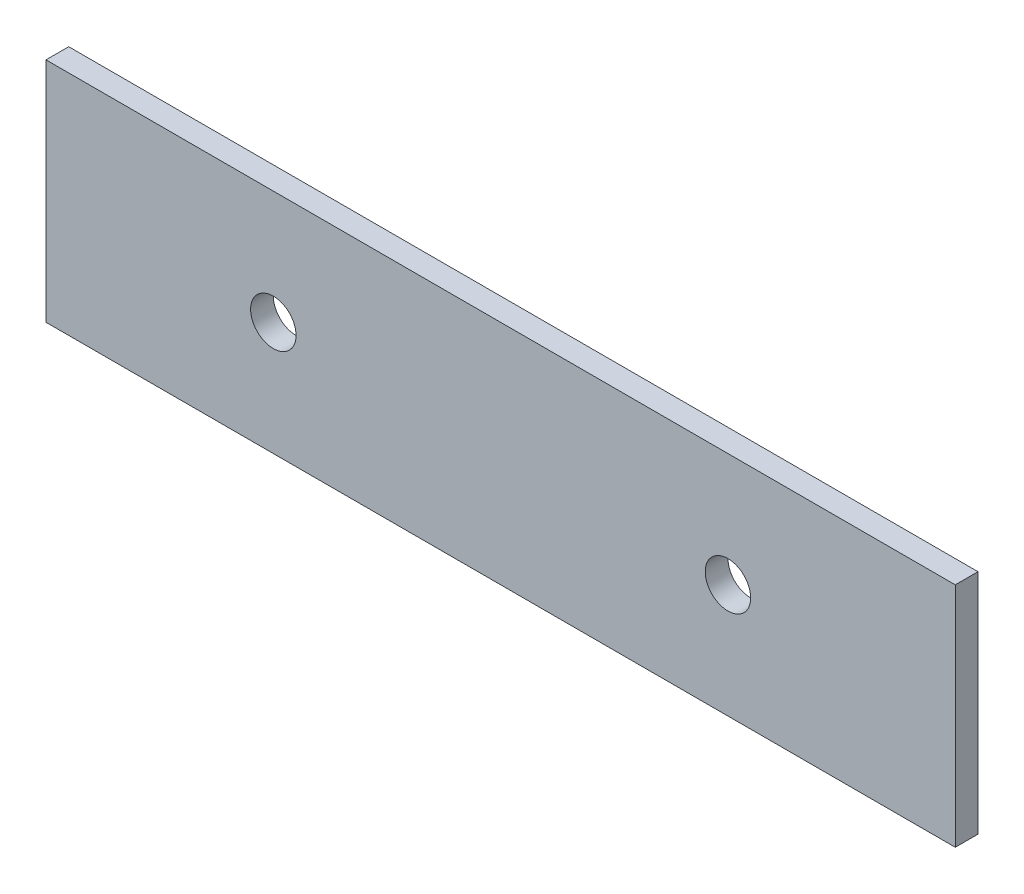
ISO-10303-21;
HEADER;
FILE_DESCRIPTION(('STEP AP214'),'2;1');
FILE_NAME('part.step','',(''),(''),'','','');
FILE_SCHEMA(('AUTOMOTIVE_DESIGN { 1 0 10303 214 1 1 1 1 }'));
ENDSEC;
DATA;
#1=APPLICATION_CONTEXT('core data for automotive mechanical design processes');
#2=APPLICATION_PROTOCOL_DEFINITION('international standard','automotive_design',2000,#1);
#3=PRODUCT_CONTEXT('',#1,'mechanical');
#4=PRODUCT('Part','Part','',(#3));
#5=PRODUCT_RELATED_PRODUCT_CATEGORY('part','',(#4));
#6=PRODUCT_DEFINITION_FORMATION('','',#4);
#7=PRODUCT_DEFINITION_CONTEXT('part definition',#1,'design');
#8=PRODUCT_DEFINITION('design','',#6,#7);
#9=PRODUCT_DEFINITION_SHAPE('','',#8);
#10=(LENGTH_UNIT() NAMED_UNIT(*) SI_UNIT(.MILLI.,.METRE.));
#11=(NAMED_UNIT(*) PLANE_ANGLE_UNIT() SI_UNIT($,.RADIAN.));
#12=(NAMED_UNIT(*) SI_UNIT($,.STERADIAN.) SOLID_ANGLE_UNIT());
#13=UNCERTAINTY_MEASURE_WITH_UNIT(LENGTH_MEASURE(1.E-05),#10,'distance_accuracy_value','');
#14=(GEOMETRIC_REPRESENTATION_CONTEXT(3) GLOBAL_UNCERTAINTY_ASSIGNED_CONTEXT((#13)) GLOBAL_UNIT_ASSIGNED_CONTEXT((#10,
#11,#12)) REPRESENTATION_CONTEXT('',''));
#15=CARTESIAN_POINT('',(0.,0.,0.));
#16=DIRECTION('',(0.,0.,1.));
#17=DIRECTION('',(1.,0.,0.));
#18=AXIS2_PLACEMENT_3D('',#15,#16,#17);
#19=CARTESIAN_POINT('',(40.,10.,2.));
#20=DIRECTION('',(-1.,0.,0.));
#21=DIRECTION('',(0.,-1.,0.));
#22=AXIS2_PLACEMENT_3D('',#19,#20,#21);
#23=PLANE('',#22);
#24=DIRECTION('',(0.,1.,0.));
#25=VECTOR('',#24,1.);
#26=CARTESIAN_POINT('',(40.,10.,0.));
#27=LINE('',#26,#25);
#28=CARTESIAN_POINT('',(40.,-10.,0.));
#29=VERTEX_POINT('',#28);
#30=CARTESIAN_POINT('',(40.,10.,0.));
#31=VERTEX_POINT('',#30);
#32=EDGE_CURVE('E97',#29,#31,#27,.T.);
#33=ORIENTED_EDGE('',*,*,#32,.T.);
#34=DIRECTION('',(0.,0.,-1.));
#35=VECTOR('',#34,1.);
#36=CARTESIAN_POINT('',(40.,10.,2.));
#37=LINE('',#36,#35);
#38=CARTESIAN_POINT('',(40.,10.,2.));
#39=VERTEX_POINT('',#38);
#40=EDGE_CURVE('E11',#39,#31,#37,.T.);
#41=ORIENTED_EDGE('',*,*,#40,.F.);
#42=DIRECTION('',(0.,1.,0.));
#43=VECTOR('',#42,1.);
#44=CARTESIAN_POINT('',(40.,10.,2.));
#45=LINE('',#44,#43);
#46=CARTESIAN_POINT('',(40.,-10.,2.));
#47=VERTEX_POINT('',#46);
#48=EDGE_CURVE('E85',#47,#39,#45,.T.);
#49=ORIENTED_EDGE('',*,*,#48,.F.);
#50=DIRECTION('',(0.,0.,-1.));
#51=VECTOR('',#50,1.);
#52=CARTESIAN_POINT('',(40.,-10.,2.));
#53=LINE('',#52,#51);
#54=EDGE_CURVE('E93',#47,#29,#53,.T.);
#55=ORIENTED_EDGE('',*,*,#54,.T.);
#56=EDGE_LOOP('',(#33,#41,#49,#55));
#57=FACE_BOUND('',#56,.T.);
#58=ADVANCED_FACE('F34',(#57),#23,.F.);
#59=CARTESIAN_POINT('',(-40.,10.,2.));
#60=DIRECTION('',(0.,-1.,0.));
#61=DIRECTION('',(0.,0.,-1.));
#62=AXIS2_PLACEMENT_3D('',#59,#60,#61);
#63=PLANE('',#62);
#64=DIRECTION('',(-1.,0.,0.));
#65=VECTOR('',#64,1.);
#66=CARTESIAN_POINT('',(-40.,10.,0.));
#67=LINE('',#66,#65);
#68=CARTESIAN_POINT('',(-40.,10.,0.));
#69=VERTEX_POINT('',#68);
#70=EDGE_CURVE('E89',#31,#69,#67,.T.);
#71=ORIENTED_EDGE('',*,*,#70,.T.);
#72=DIRECTION('',(0.,0.,-1.));
#73=VECTOR('',#72,1.);
#74=CARTESIAN_POINT('',(-40.,10.,2.));
#75=LINE('',#74,#73);
#76=CARTESIAN_POINT('',(-40.,10.,2.));
#77=VERTEX_POINT('',#76);
#78=EDGE_CURVE('E42',#77,#69,#75,.T.);
#79=ORIENTED_EDGE('',*,*,#78,.F.);
#80=DIRECTION('',(-1.,0.,0.));
#81=VECTOR('',#80,1.);
#82=CARTESIAN_POINT('',(-40.,10.,2.));
#83=LINE('',#82,#81);
#84=EDGE_CURVE('E80',#39,#77,#83,.T.);
#85=ORIENTED_EDGE('',*,*,#84,.F.);
#86=ORIENTED_EDGE('',*,*,#40,.T.);
#87=EDGE_LOOP('',(#71,#79,#85,#86));
#88=FACE_BOUND('',#87,.T.);
#89=ADVANCED_FACE('F88',(#88),#63,.F.);
#90=CARTESIAN_POINT('',(-40.,10.,2.));
#91=DIRECTION('',(1.,0.,0.));
#92=DIRECTION('',(0.,0.,-1.));
#93=AXIS2_PLACEMENT_3D('',#90,#91,#92);
#94=PLANE('',#93);
#95=DIRECTION('',(0.,-1.,0.));
#96=VECTOR('',#95,1.);
#97=CARTESIAN_POINT('',(-40.,10.,0.));
#98=LINE('',#97,#96);
#99=CARTESIAN_POINT('',(-40.,-10.,0.));
#100=VERTEX_POINT('',#99);
#101=EDGE_CURVE('E67',#69,#100,#98,.T.);
#102=ORIENTED_EDGE('',*,*,#101,.T.);
#103=DIRECTION('',(0.,0.,-1.));
#104=VECTOR('',#103,1.);
#105=CARTESIAN_POINT('',(-40.,-10.,2.));
#106=LINE('',#105,#104);
#107=CARTESIAN_POINT('',(-40.,-10.,2.));
#108=VERTEX_POINT('',#107);
#109=EDGE_CURVE('E90',#108,#100,#106,.T.);
#110=ORIENTED_EDGE('',*,*,#109,.F.);
#111=DIRECTION('',(0.,-1.,0.));
#112=VECTOR('',#111,1.);
#113=CARTESIAN_POINT('',(-40.,10.,2.));
#114=LINE('',#113,#112);
#115=EDGE_CURVE('E83',#77,#108,#114,.T.);
#116=ORIENTED_EDGE('',*,*,#115,.F.);
#117=ORIENTED_EDGE('',*,*,#78,.T.);
#118=EDGE_LOOP('',(#102,#110,#116,#117));
#119=FACE_BOUND('',#118,.T.);
#120=ADVANCED_FACE('F91',(#119),#94,.F.);
#121=CARTESIAN_POINT('',(-40.,-10.,2.));
#122=DIRECTION('',(0.,1.,0.));
#123=DIRECTION('',(0.,0.,1.));
#124=AXIS2_PLACEMENT_3D('',#121,#122,#123);
#125=PLANE('',#124);
#126=DIRECTION('',(1.,0.,0.));
#127=VECTOR('',#126,1.);
#128=CARTESIAN_POINT('',(-40.,-10.,0.));
#129=LINE('',#128,#127);
#130=EDGE_CURVE('E73',#100,#29,#129,.T.);
#131=ORIENTED_EDGE('',*,*,#130,.T.);
#132=ORIENTED_EDGE('',*,*,#54,.F.);
#133=DIRECTION('',(1.,0.,0.));
#134=VECTOR('',#133,1.);
#135=CARTESIAN_POINT('',(-40.,-10.,2.));
#136=LINE('',#135,#134);
#137=EDGE_CURVE('E50',#108,#47,#136,.T.);
#138=ORIENTED_EDGE('',*,*,#137,.F.);
#139=ORIENTED_EDGE('',*,*,#109,.T.);
#140=EDGE_LOOP('',(#131,#132,#138,#139));
#141=FACE_BOUND('',#140,.T.);
#142=ADVANCED_FACE('F105',(#141),#125,.F.);
#143=CARTESIAN_POINT('',(0.,0.,2.));
#144=DIRECTION('',(0.,0.,1.));
#145=DIRECTION('',(1.,0.,0.));
#146=AXIS2_PLACEMENT_3D('',#143,#144,#145);
#147=PLANE('',#146);
#148=CARTESIAN_POINT('',(-20.,0.,2.));
#149=DIRECTION('',(0.,0.,1.));
#150=DIRECTION('',(1.,0.,0.));
#151=AXIS2_PLACEMENT_3D('',#148,#149,#150);
#152=CIRCLE('',#151,2.);
#153=CARTESIAN_POINT('',(-18.,0.,2.));
#154=VERTEX_POINT('',#153);
#155=EDGE_CURVE('E117',#154,#154,#152,.T.);
#156=ORIENTED_EDGE('',*,*,#155,.F.);
#157=EDGE_LOOP('',(#156));
#158=FACE_BOUND('',#157,.T.);
#159=CARTESIAN_POINT('',(20.,0.,2.));
#160=DIRECTION('',(0.,0.,1.));
#161=DIRECTION('',(1.,0.,0.));
#162=AXIS2_PLACEMENT_3D('',#159,#160,#161);
#163=CIRCLE('',#162,2.);
#164=CARTESIAN_POINT('',(22.,0.,2.));
#165=VERTEX_POINT('',#164);
#166=EDGE_CURVE('E111',#165,#165,#163,.T.);
#167=ORIENTED_EDGE('',*,*,#166,.F.);
#168=EDGE_LOOP('',(#167));
#169=FACE_BOUND('',#168,.T.);
#170=ORIENTED_EDGE('',*,*,#48,.T.);
#171=ORIENTED_EDGE('',*,*,#84,.T.);
#172=ORIENTED_EDGE('',*,*,#115,.T.);
#173=ORIENTED_EDGE('',*,*,#137,.T.);
#174=EDGE_LOOP('',(#170,#171,#172,#173));
#175=FACE_BOUND('',#174,.T.);
#176=ADVANCED_FACE('F81',(#158,#169,#175),#147,.T.);
#177=CARTESIAN_POINT('',(0.,0.,0.));
#178=DIRECTION('',(0.,0.,1.));
#179=DIRECTION('',(1.,0.,0.));
#180=AXIS2_PLACEMENT_3D('',#177,#178,#179);
#181=PLANE('',#180);
#182=CARTESIAN_POINT('',(-20.,0.,0.));
#183=DIRECTION('',(0.,0.,1.));
#184=DIRECTION('',(1.,0.,0.));
#185=AXIS2_PLACEMENT_3D('',#182,#183,#184);
#186=CIRCLE('',#185,2.);
#187=CARTESIAN_POINT('',(-18.,0.,0.));
#188=VERTEX_POINT('',#187);
#189=EDGE_CURVE('E100',#188,#188,#186,.T.);
#190=ORIENTED_EDGE('',*,*,#189,.T.);
#191=EDGE_LOOP('',(#190));
#192=FACE_BOUND('',#191,.T.);
#193=CARTESIAN_POINT('',(20.,0.,0.));
#194=DIRECTION('',(0.,0.,1.));
#195=DIRECTION('',(1.,0.,0.));
#196=AXIS2_PLACEMENT_3D('',#193,#194,#195);
#197=CIRCLE('',#196,2.);
#198=CARTESIAN_POINT('',(22.,0.,0.));
#199=VERTEX_POINT('',#198);
#200=EDGE_CURVE('E114',#199,#199,#197,.T.);
#201=ORIENTED_EDGE('',*,*,#200,.T.);
#202=EDGE_LOOP('',(#201));
#203=FACE_BOUND('',#202,.T.);
#204=ORIENTED_EDGE('',*,*,#32,.F.);
#205=ORIENTED_EDGE('',*,*,#130,.F.);
#206=ORIENTED_EDGE('',*,*,#101,.F.);
#207=ORIENTED_EDGE('',*,*,#70,.F.);
#208=EDGE_LOOP('',(#204,#205,#206,#207));
#209=FACE_BOUND('',#208,.T.);
#210=ADVANCED_FACE('F108',(#192,#203,#209),#181,.F.);
#211=CARTESIAN_POINT('',(20.,0.,0.));
#212=DIRECTION('',(0.,0.,1.));
#213=DIRECTION('',(1.,0.,0.));
#214=AXIS2_PLACEMENT_3D('',#211,#212,#213);
#215=CYLINDRICAL_SURFACE('',#214,2.);
#216=ORIENTED_EDGE('',*,*,#200,.F.);
#217=EDGE_LOOP('',(#216));
#218=FACE_BOUND('',#217,.T.);
#219=ORIENTED_EDGE('',*,*,#166,.T.);
#220=EDGE_LOOP('',(#219));
#221=FACE_BOUND('',#220,.T.);
#222=ADVANCED_FACE('F128',(#218,#221),#215,.F.);
#223=CARTESIAN_POINT('',(-20.,0.,0.));
#224=DIRECTION('',(0.,0.,1.));
#225=DIRECTION('',(1.,0.,0.));
#226=AXIS2_PLACEMENT_3D('',#223,#224,#225);
#227=CYLINDRICAL_SURFACE('',#226,2.);
#228=ORIENTED_EDGE('',*,*,#189,.F.);
#229=EDGE_LOOP('',(#228));
#230=FACE_BOUND('',#229,.T.);
#231=ORIENTED_EDGE('',*,*,#155,.T.);
#232=EDGE_LOOP('',(#231));
#233=FACE_BOUND('',#232,.T.);
#234=ADVANCED_FACE('F125',(#230,#233),#227,.F.);
#235=CLOSED_SHELL('',(#58,#89,#120,#142,#176,#210,#222,#234));
#236=MANIFOLD_SOLID_BREP('B2',#235);
#237=ADVANCED_BREP_SHAPE_REPRESENTATION('',(#18,#236),#14);
#238=SHAPE_DEFINITION_REPRESENTATION(#9,#237);
ENDSEC;
END-ISO-10303-21;
